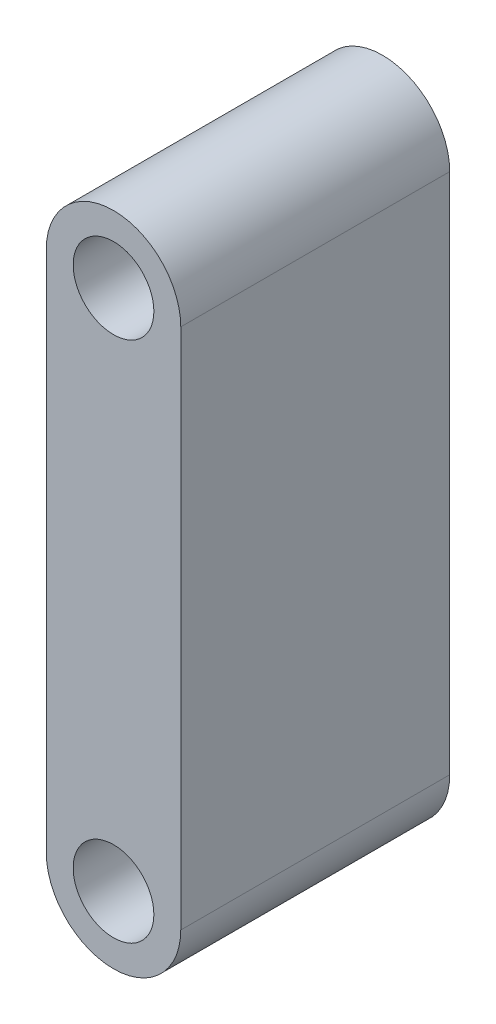
ISO-10303-21;
HEADER;
FILE_DESCRIPTION(('STEP AP214'),'2;1');
FILE_NAME('part.step','',(''),(''),'','','');
FILE_SCHEMA(('AUTOMOTIVE_DESIGN { 1 0 10303 214 1 1 1 1 }'));
ENDSEC;
DATA;
#1=APPLICATION_CONTEXT('core data for automotive mechanical design processes');
#2=APPLICATION_PROTOCOL_DEFINITION('international standard','automotive_design',2000,#1);
#3=PRODUCT_CONTEXT('',#1,'mechanical');
#4=PRODUCT('Part','Part','',(#3));
#5=PRODUCT_RELATED_PRODUCT_CATEGORY('part','',(#4));
#6=PRODUCT_DEFINITION_FORMATION('','',#4);
#7=PRODUCT_DEFINITION_CONTEXT('part definition',#1,'design');
#8=PRODUCT_DEFINITION('design','',#6,#7);
#9=PRODUCT_DEFINITION_SHAPE('','',#8);
#10=(LENGTH_UNIT() NAMED_UNIT(*) SI_UNIT(.MILLI.,.METRE.));
#11=(NAMED_UNIT(*) PLANE_ANGLE_UNIT() SI_UNIT($,.RADIAN.));
#12=(NAMED_UNIT(*) SI_UNIT($,.STERADIAN.) SOLID_ANGLE_UNIT());
#13=UNCERTAINTY_MEASURE_WITH_UNIT(LENGTH_MEASURE(1.E-05),#10,'distance_accuracy_value','');
#14=(GEOMETRIC_REPRESENTATION_CONTEXT(3) GLOBAL_UNCERTAINTY_ASSIGNED_CONTEXT((#13)) GLOBAL_UNIT_ASSIGNED_CONTEXT((#10,
#11,#12)) REPRESENTATION_CONTEXT('',''));
#15=CARTESIAN_POINT('',(0.,0.,0.));
#16=DIRECTION('',(0.,0.,1.));
#17=DIRECTION('',(1.,0.,0.));
#18=AXIS2_PLACEMENT_3D('',#15,#16,#17);
#19=CARTESIAN_POINT('',(0.,154.556382451077,50.));
#20=DIRECTION('',(0.,0.,1.));
#21=DIRECTION('',(1.,0.,0.));
#22=AXIS2_PLACEMENT_3D('',#19,#20,#21);
#23=PLANE('',#22);
#24=CARTESIAN_POINT('',(0.,154.556382451077,50.));
#25=DIRECTION('',(0.,0.,1.));
#26=DIRECTION('',(1.,0.,0.));
#27=AXIS2_PLACEMENT_3D('',#24,#25,#26);
#28=CIRCLE('',#27,15.);
#29=CARTESIAN_POINT('',(15.,154.556382451077,50.));
#30=VERTEX_POINT('',#29);
#31=EDGE_CURVE('E112',#30,#30,#28,.T.);
#32=ORIENTED_EDGE('',*,*,#31,.F.);
#33=EDGE_LOOP('',(#32));
#34=FACE_BOUND('',#33,.T.);
#35=CARTESIAN_POINT('',(0.,154.556382451077,50.));
#36=DIRECTION('',(0.,0.,1.));
#37=DIRECTION('',(1.,0.,0.));
#38=AXIS2_PLACEMENT_3D('',#35,#36,#37);
#39=CIRCLE('',#38,25.);
#40=CARTESIAN_POINT('',(25.,154.556382451077,50.));
#41=VERTEX_POINT('',#40);
#42=CARTESIAN_POINT('',(-25.,154.556382451077,50.));
#43=VERTEX_POINT('',#42);
#44=EDGE_CURVE('E92',#41,#43,#39,.T.);
#45=ORIENTED_EDGE('',*,*,#44,.T.);
#46=DIRECTION('',(0.,-1.,0.));
#47=VECTOR('',#46,1.);
#48=CARTESIAN_POINT('',(-25.,154.556382451077,50.));
#49=LINE('',#48,#47);
#50=CARTESIAN_POINT('',(-25.,-39.6436175489231,50.));
#51=VERTEX_POINT('',#50);
#52=EDGE_CURVE('E87',#43,#51,#49,.T.);
#53=ORIENTED_EDGE('',*,*,#52,.T.);
#54=CARTESIAN_POINT('',(0.,-39.6436175489231,50.));
#55=DIRECTION('',(0.,0.,1.));
#56=DIRECTION('',(1.,0.,0.));
#57=AXIS2_PLACEMENT_3D('',#54,#55,#56);
#58=CIRCLE('',#57,25.);
#59=CARTESIAN_POINT('',(25.,-39.6436175489231,50.));
#60=VERTEX_POINT('',#59);
#61=EDGE_CURVE('E90',#51,#60,#58,.T.);
#62=ORIENTED_EDGE('',*,*,#61,.T.);
#63=DIRECTION('',(0.,1.,0.));
#64=VECTOR('',#63,1.);
#65=CARTESIAN_POINT('',(25.,154.556382451077,50.));
#66=LINE('',#65,#64);
#67=EDGE_CURVE('E57',#60,#41,#66,.T.);
#68=ORIENTED_EDGE('',*,*,#67,.T.);
#69=EDGE_LOOP('',(#45,#53,#62,#68));
#70=FACE_BOUND('',#69,.T.);
#71=CARTESIAN_POINT('',(0.,-39.6436175489231,50.));
#72=DIRECTION('',(0.,0.,1.));
#73=DIRECTION('',(1.,0.,0.));
#74=AXIS2_PLACEMENT_3D('',#71,#72,#73);
#75=CIRCLE('',#74,15.);
#76=CARTESIAN_POINT('',(15.,-39.6436175489231,50.));
#77=VERTEX_POINT('',#76);
#78=EDGE_CURVE('E134',#77,#77,#75,.T.);
#79=ORIENTED_EDGE('',*,*,#78,.F.);
#80=EDGE_LOOP('',(#79));
#81=FACE_BOUND('',#80,.T.);
#82=ADVANCED_FACE('F39',(#34,#70,#81),#23,.T.);
#83=CARTESIAN_POINT('',(0.,154.556382451077,-50.));
#84=DIRECTION('',(0.,0.,1.));
#85=DIRECTION('',(1.,0.,0.));
#86=AXIS2_PLACEMENT_3D('',#83,#84,#85);
#87=PLANE('',#86);
#88=CARTESIAN_POINT('',(0.,154.556382451077,-50.));
#89=DIRECTION('',(0.,0.,1.));
#90=DIRECTION('',(1.,0.,0.));
#91=AXIS2_PLACEMENT_3D('',#88,#89,#90);
#92=CIRCLE('',#91,25.);
#93=CARTESIAN_POINT('',(25.,154.556382451077,-50.));
#94=VERTEX_POINT('',#93);
#95=CARTESIAN_POINT('',(-25.,154.556382451077,-50.));
#96=VERTEX_POINT('',#95);
#97=EDGE_CURVE('E108',#94,#96,#92,.T.);
#98=ORIENTED_EDGE('',*,*,#97,.F.);
#99=DIRECTION('',(0.,1.,0.));
#100=VECTOR('',#99,1.);
#101=CARTESIAN_POINT('',(25.,154.556382451077,-50.));
#102=LINE('',#101,#100);
#103=CARTESIAN_POINT('',(25.,-39.6436175489231,-50.));
#104=VERTEX_POINT('',#103);
#105=EDGE_CURVE('E80',#104,#94,#102,.T.);
#106=ORIENTED_EDGE('',*,*,#105,.F.);
#107=CARTESIAN_POINT('',(0.,-39.6436175489231,-50.));
#108=DIRECTION('',(0.,0.,1.));
#109=DIRECTION('',(1.,0.,0.));
#110=AXIS2_PLACEMENT_3D('',#107,#108,#109);
#111=CIRCLE('',#110,25.);
#112=CARTESIAN_POINT('',(-25.,-39.6436175489231,-50.));
#113=VERTEX_POINT('',#112);
#114=EDGE_CURVE('E74',#113,#104,#111,.T.);
#115=ORIENTED_EDGE('',*,*,#114,.F.);
#116=DIRECTION('',(0.,-1.,0.));
#117=VECTOR('',#116,1.);
#118=CARTESIAN_POINT('',(-25.,154.556382451077,-50.));
#119=LINE('',#118,#117);
#120=EDGE_CURVE('E97',#96,#113,#119,.T.);
#121=ORIENTED_EDGE('',*,*,#120,.F.);
#122=EDGE_LOOP('',(#98,#106,#115,#121));
#123=FACE_BOUND('',#122,.T.);
#124=CARTESIAN_POINT('',(0.,154.556382451077,-50.));
#125=DIRECTION('',(0.,0.,1.));
#126=DIRECTION('',(1.,0.,0.));
#127=AXIS2_PLACEMENT_3D('',#124,#125,#126);
#128=CIRCLE('',#127,15.);
#129=CARTESIAN_POINT('',(15.,154.556382451077,-50.));
#130=VERTEX_POINT('',#129);
#131=EDGE_CURVE('E130',#130,#130,#128,.T.);
#132=ORIENTED_EDGE('',*,*,#131,.T.);
#133=EDGE_LOOP('',(#132));
#134=FACE_BOUND('',#133,.T.);
#135=CARTESIAN_POINT('',(0.,-39.6436175489231,-50.));
#136=DIRECTION('',(0.,0.,1.));
#137=DIRECTION('',(1.,0.,0.));
#138=AXIS2_PLACEMENT_3D('',#135,#136,#137);
#139=CIRCLE('',#138,15.);
#140=CARTESIAN_POINT('',(15.,-39.6436175489231,-50.));
#141=VERTEX_POINT('',#140);
#142=EDGE_CURVE('E138',#141,#141,#139,.T.);
#143=ORIENTED_EDGE('',*,*,#142,.T.);
#144=EDGE_LOOP('',(#143));
#145=FACE_BOUND('',#144,.T.);
#146=ADVANCED_FACE('F125',(#123,#134,#145),#87,.F.);
#147=CARTESIAN_POINT('',(0.,154.556382451077,50.));
#148=DIRECTION('',(0.,0.,-1.));
#149=DIRECTION('',(-1.,0.,0.));
#150=AXIS2_PLACEMENT_3D('',#147,#148,#149);
#151=CYLINDRICAL_SURFACE('',#150,25.);
#152=ORIENTED_EDGE('',*,*,#97,.T.);
#153=DIRECTION('',(0.,0.,-1.));
#154=VECTOR('',#153,1.);
#155=CARTESIAN_POINT('',(-25.,154.556382451077,50.));
#156=LINE('',#155,#154);
#157=EDGE_CURVE('E11',#43,#96,#156,.T.);
#158=ORIENTED_EDGE('',*,*,#157,.F.);
#159=ORIENTED_EDGE('',*,*,#44,.F.);
#160=DIRECTION('',(0.,0.,-1.));
#161=VECTOR('',#160,1.);
#162=CARTESIAN_POINT('',(25.,154.556382451077,50.));
#163=LINE('',#162,#161);
#164=EDGE_CURVE('E104',#41,#94,#163,.T.);
#165=ORIENTED_EDGE('',*,*,#164,.T.);
#166=EDGE_LOOP('',(#152,#158,#159,#165));
#167=FACE_BOUND('',#166,.T.);
#168=ADVANCED_FACE('F41',(#167),#151,.T.);
#169=CARTESIAN_POINT('',(-25.,154.556382451077,50.));
#170=DIRECTION('',(1.,0.,0.));
#171=DIRECTION('',(0.,1.,0.));
#172=AXIS2_PLACEMENT_3D('',#169,#170,#171);
#173=PLANE('',#172);
#174=ORIENTED_EDGE('',*,*,#120,.T.);
#175=DIRECTION('',(0.,0.,-1.));
#176=VECTOR('',#175,1.);
#177=CARTESIAN_POINT('',(-25.,-39.6436175489231,50.));
#178=LINE('',#177,#176);
#179=EDGE_CURVE('E49',#51,#113,#178,.T.);
#180=ORIENTED_EDGE('',*,*,#179,.F.);
#181=ORIENTED_EDGE('',*,*,#52,.F.);
#182=ORIENTED_EDGE('',*,*,#157,.T.);
#183=EDGE_LOOP('',(#174,#180,#181,#182));
#184=FACE_BOUND('',#183,.T.);
#185=ADVANCED_FACE('F96',(#184),#173,.F.);
#186=CARTESIAN_POINT('',(0.,-39.6436175489231,50.));
#187=DIRECTION('',(0.,0.,-1.));
#188=DIRECTION('',(-1.,0.,0.));
#189=AXIS2_PLACEMENT_3D('',#186,#187,#188);
#190=CYLINDRICAL_SURFACE('',#189,25.);
#191=ORIENTED_EDGE('',*,*,#114,.T.);
#192=DIRECTION('',(0.,0.,-1.));
#193=VECTOR('',#192,1.);
#194=CARTESIAN_POINT('',(25.,-39.6436175489231,50.));
#195=LINE('',#194,#193);
#196=EDGE_CURVE('E99',#60,#104,#195,.T.);
#197=ORIENTED_EDGE('',*,*,#196,.F.);
#198=ORIENTED_EDGE('',*,*,#61,.F.);
#199=ORIENTED_EDGE('',*,*,#179,.T.);
#200=EDGE_LOOP('',(#191,#197,#198,#199));
#201=FACE_BOUND('',#200,.T.);
#202=ADVANCED_FACE('F100',(#201),#190,.T.);
#203=CARTESIAN_POINT('',(25.,154.556382451077,50.));
#204=DIRECTION('',(-1.,0.,0.));
#205=DIRECTION('',(0.,-1.,0.));
#206=AXIS2_PLACEMENT_3D('',#203,#204,#205);
#207=PLANE('',#206);
#208=ORIENTED_EDGE('',*,*,#105,.T.);
#209=ORIENTED_EDGE('',*,*,#164,.F.);
#210=ORIENTED_EDGE('',*,*,#67,.F.);
#211=ORIENTED_EDGE('',*,*,#196,.T.);
#212=EDGE_LOOP('',(#208,#209,#210,#211));
#213=FACE_BOUND('',#212,.T.);
#214=ADVANCED_FACE('F122',(#213),#207,.F.);
#215=CARTESIAN_POINT('',(0.,154.556382451077,50.));
#216=DIRECTION('',(0.,0.,-1.));
#217=DIRECTION('',(-1.,0.,0.));
#218=AXIS2_PLACEMENT_3D('',#215,#216,#217);
#219=CYLINDRICAL_SURFACE('',#218,15.);
#220=ORIENTED_EDGE('',*,*,#31,.T.);
#221=EDGE_LOOP('',(#220));
#222=FACE_BOUND('',#221,.T.);
#223=ORIENTED_EDGE('',*,*,#131,.F.);
#224=EDGE_LOOP('',(#223));
#225=FACE_BOUND('',#224,.T.);
#226=ADVANCED_FACE('F157',(#222,#225),#219,.F.);
#227=CARTESIAN_POINT('',(0.,-39.6436175489231,50.));
#228=DIRECTION('',(0.,0.,-1.));
#229=DIRECTION('',(-1.,0.,0.));
#230=AXIS2_PLACEMENT_3D('',#227,#228,#229);
#231=CYLINDRICAL_SURFACE('',#230,15.);
#232=ORIENTED_EDGE('',*,*,#78,.T.);
#233=EDGE_LOOP('',(#232));
#234=FACE_BOUND('',#233,.T.);
#235=ORIENTED_EDGE('',*,*,#142,.F.);
#236=EDGE_LOOP('',(#235));
#237=FACE_BOUND('',#236,.T.);
#238=ADVANCED_FACE('F146',(#234,#237),#231,.F.);
#239=CLOSED_SHELL('',(#82,#146,#168,#185,#202,#214,#226,#238));
#240=MANIFOLD_SOLID_BREP('B2',#239);
#241=ADVANCED_BREP_SHAPE_REPRESENTATION('',(#18,#240),#14);
#242=SHAPE_DEFINITION_REPRESENTATION(#9,#241);
ENDSEC;
END-ISO-10303-21;
